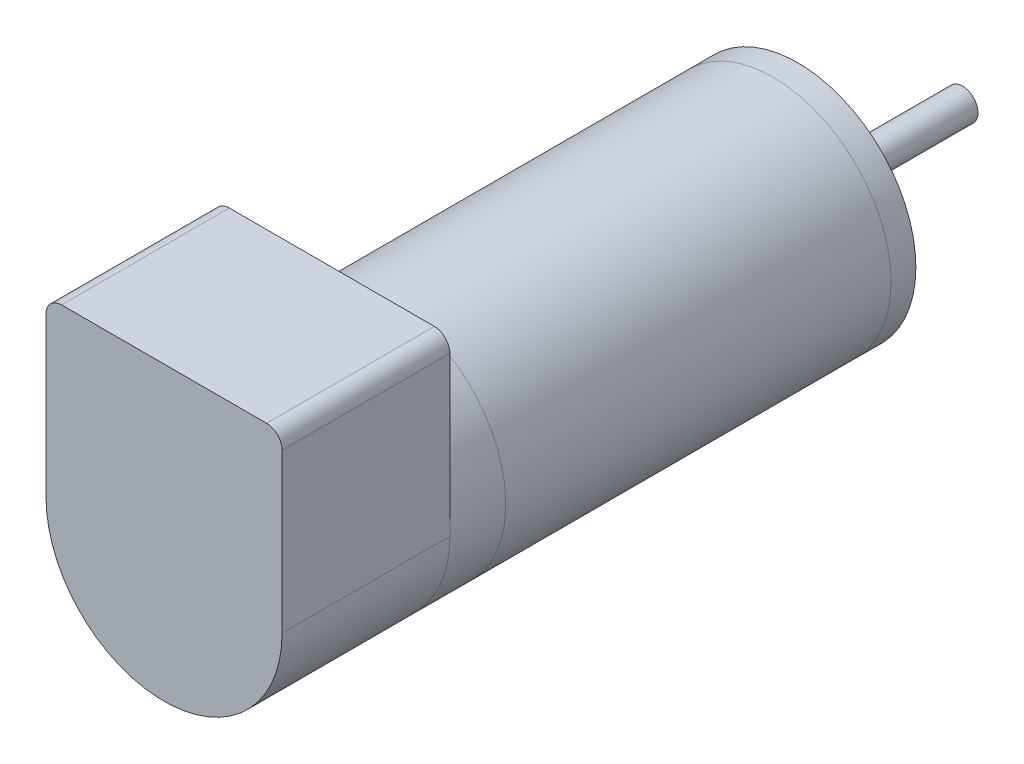
ISO-10303-21;
HEADER;
FILE_DESCRIPTION(('STEP AP214'),'2;1');
FILE_NAME('part.step','',(''),(''),'','','');
FILE_SCHEMA(('AUTOMOTIVE_DESIGN { 1 0 10303 214 1 1 1 1 }'));
ENDSEC;
DATA;
#1=APPLICATION_CONTEXT('core data for automotive mechanical design processes');
#2=APPLICATION_PROTOCOL_DEFINITION('international standard','automotive_design',2000,#1);
#3=PRODUCT_CONTEXT('',#1,'mechanical');
#4=PRODUCT('Part','Part','',(#3));
#5=PRODUCT_RELATED_PRODUCT_CATEGORY('part','',(#4));
#6=PRODUCT_DEFINITION_FORMATION('','',#4);
#7=PRODUCT_DEFINITION_CONTEXT('part definition',#1,'design');
#8=PRODUCT_DEFINITION('design','',#6,#7);
#9=PRODUCT_DEFINITION_SHAPE('','',#8);
#10=(LENGTH_UNIT() NAMED_UNIT(*) SI_UNIT(.MILLI.,.METRE.));
#11=(NAMED_UNIT(*) PLANE_ANGLE_UNIT() SI_UNIT($,.RADIAN.));
#12=(NAMED_UNIT(*) SI_UNIT($,.STERADIAN.) SOLID_ANGLE_UNIT());
#13=UNCERTAINTY_MEASURE_WITH_UNIT(LENGTH_MEASURE(1.E-05),#10,'distance_accuracy_value','');
#14=(GEOMETRIC_REPRESENTATION_CONTEXT(3) GLOBAL_UNCERTAINTY_ASSIGNED_CONTEXT((#13)) GLOBAL_UNIT_ASSIGNED_CONTEXT((#10,
#11,#12)) REPRESENTATION_CONTEXT('',''));
#15=CARTESIAN_POINT('',(0.,0.,0.));
#16=DIRECTION('',(0.,0.,1.));
#17=DIRECTION('',(1.,0.,0.));
#18=AXIS2_PLACEMENT_3D('',#15,#16,#17);
#19=CARTESIAN_POINT('',(0.,0.,0.));
#20=DIRECTION('',(0.,0.,1.));
#21=DIRECTION('',(1.,0.,0.));
#22=AXIS2_PLACEMENT_3D('',#19,#20,#21);
#23=CYLINDRICAL_SURFACE('',#22,19.);
#24=CARTESIAN_POINT('',(0.,0.,0.));
#25=DIRECTION('',(0.,0.,1.));
#26=DIRECTION('',(1.,0.,0.));
#27=AXIS2_PLACEMENT_3D('',#24,#25,#26);
#28=CIRCLE('',#27,19.);
#29=CARTESIAN_POINT('',(19.,0.,0.));
#30=VERTEX_POINT('',#29);
#31=CARTESIAN_POINT('',(0.,19.,0.));
#32=VERTEX_POINT('',#31);
#33=EDGE_CURVE('E150',#30,#32,#28,.T.);
#34=ORIENTED_EDGE('',*,*,#33,.F.);
#35=CARTESIAN_POINT('',(0.,0.,0.));
#36=DIRECTION('',(0.,0.,-1.));
#37=DIRECTION('',(-1.,0.,0.));
#38=AXIS2_PLACEMENT_3D('',#35,#36,#37);
#39=CIRCLE('',#38,19.);
#40=CARTESIAN_POINT('',(0.,-19.,0.));
#41=VERTEX_POINT('',#40);
#42=EDGE_CURVE('E127',#30,#41,#39,.T.);
#43=ORIENTED_EDGE('',*,*,#42,.T.);
#44=CARTESIAN_POINT('',(-19.,0.,0.));
#45=VERTEX_POINT('',#44);
#46=EDGE_CURVE('E157',#41,#45,#39,.T.);
#47=ORIENTED_EDGE('',*,*,#46,.T.);
#48=EDGE_CURVE('E149',#32,#45,#28,.T.);
#49=ORIENTED_EDGE('',*,*,#48,.F.);
#50=EDGE_LOOP('',(#34,#43,#47,#49));
#51=FACE_BOUND('',#50,.T.);
#52=CARTESIAN_POINT('',(0.,0.,-9.));
#53=DIRECTION('',(0.,0.,-1.));
#54=DIRECTION('',(0.,1.,0.));
#55=AXIS2_PLACEMENT_3D('',#52,#53,#54);
#56=CIRCLE('',#55,19.);
#57=CARTESIAN_POINT('',(0.,19.,-9.));
#58=VERTEX_POINT('',#57);
#59=CARTESIAN_POINT('',(0.,-19.,-9.00000000000001));
#60=VERTEX_POINT('',#59);
#61=EDGE_CURVE('E11',#58,#60,#56,.T.);
#62=ORIENTED_EDGE('',*,*,#61,.F.);
#63=EDGE_CURVE('E41',#60,#58,#56,.T.);
#64=ORIENTED_EDGE('',*,*,#63,.F.);
#65=EDGE_LOOP('',(#62,#64));
#66=FACE_BOUND('',#65,.T.);
#67=ADVANCED_FACE('F37',(#51,#66),#23,.T.);
#68=ORIENTED_EDGE('',*,*,#42,.F.);
#69=DIRECTION('',(0.,0.,-1.));
#70=VECTOR('',#69,1.);
#71=CARTESIAN_POINT('',(19.,0.,27.));
#72=LINE('',#71,#70);
#73=CARTESIAN_POINT('',(19.,0.,27.));
#74=VERTEX_POINT('',#73);
#75=EDGE_CURVE('E108',#74,#30,#72,.T.);
#76=ORIENTED_EDGE('',*,*,#75,.F.);
#77=CARTESIAN_POINT('',(0.,0.,27.));
#78=DIRECTION('',(0.,0.,1.));
#79=DIRECTION('',(1.,0.,0.));
#80=AXIS2_PLACEMENT_3D('',#77,#78,#79);
#81=CIRCLE('',#80,19.);
#82=CARTESIAN_POINT('',(-19.,0.,27.));
#83=VERTEX_POINT('',#82);
#84=EDGE_CURVE('E114',#83,#74,#81,.T.);
#85=ORIENTED_EDGE('',*,*,#84,.F.);
#86=DIRECTION('',(0.,0.,-1.));
#87=VECTOR('',#86,1.);
#88=CARTESIAN_POINT('',(-19.,0.,27.));
#89=LINE('',#88,#87);
#90=EDGE_CURVE('E204',#83,#45,#89,.T.);
#91=ORIENTED_EDGE('',*,*,#90,.T.);
#92=ORIENTED_EDGE('',*,*,#46,.F.);
#93=EDGE_LOOP('',(#68,#76,#85,#91,#92));
#94=FACE_BOUND('',#93,.T.);
#95=ADVANCED_FACE('F125',(#94),#23,.T.);
#96=ORIENTED_EDGE('',*,*,#63,.T.);
#97=ORIENTED_EDGE('',*,*,#61,.T.);
#98=EDGE_LOOP('',(#96,#97));
#99=FACE_BOUND('',#98,.T.);
#100=CARTESIAN_POINT('',(0.,0.,-71.));
#101=DIRECTION('',(0.,0.,-1.));
#102=DIRECTION('',(-1.,0.,0.));
#103=AXIS2_PLACEMENT_3D('',#100,#101,#102);
#104=CIRCLE('',#103,19.);
#105=CARTESIAN_POINT('',(0.,19.,-71.));
#106=VERTEX_POINT('',#105);
#107=CARTESIAN_POINT('',(0.,-19.,-71.));
#108=VERTEX_POINT('',#107);
#109=EDGE_CURVE('E156',#106,#108,#104,.T.);
#110=ORIENTED_EDGE('',*,*,#109,.F.);
#111=EDGE_CURVE('E153',#108,#106,#104,.T.);
#112=ORIENTED_EDGE('',*,*,#111,.F.);
#113=EDGE_LOOP('',(#110,#112));
#114=FACE_BOUND('',#113,.T.);
#115=ADVANCED_FACE('F172',(#99,#114),#23,.T.);
#116=ORIENTED_EDGE('',*,*,#111,.T.);
#117=ORIENTED_EDGE('',*,*,#109,.T.);
#118=EDGE_LOOP('',(#116,#117));
#119=FACE_BOUND('',#118,.T.);
#120=CARTESIAN_POINT('',(0.,0.,-75.));
#121=DIRECTION('',(0.,0.,1.));
#122=DIRECTION('',(1.,0.,0.));
#123=AXIS2_PLACEMENT_3D('',#120,#121,#122);
#124=CIRCLE('',#123,19.);
#125=CARTESIAN_POINT('',(19.,0.,-75.));
#126=VERTEX_POINT('',#125);
#127=EDGE_CURVE('E146',#126,#126,#124,.T.);
#128=ORIENTED_EDGE('',*,*,#127,.T.);
#129=EDGE_LOOP('',(#128));
#130=FACE_BOUND('',#129,.T.);
#131=ADVANCED_FACE('F39',(#119,#130),#23,.T.);
#132=CARTESIAN_POINT('',(0.,19.,-75.));
#133=DIRECTION('',(0.,0.,1.));
#134=DIRECTION('',(1.,0.,0.));
#135=AXIS2_PLACEMENT_3D('',#132,#133,#134);
#136=PLANE('',#135);
#137=CARTESIAN_POINT('',(8.83883476483179,-8.83883476483189,-75.));
#138=DIRECTION('',(0.,0.,-1.));
#139=DIRECTION('',(-1.,0.,0.));
#140=AXIS2_PLACEMENT_3D('',#137,#138,#139);
#141=CIRCLE('',#140,1.50000000000011);
#142=CARTESIAN_POINT('',(7.33883476483168,-8.83883476483189,-75.));
#143=VERTEX_POINT('',#142);
#144=EDGE_CURVE('E234',#143,#143,#141,.T.);
#145=ORIENTED_EDGE('',*,*,#144,.F.);
#146=EDGE_LOOP('',(#145));
#147=FACE_BOUND('',#146,.T.);
#148=CARTESIAN_POINT('',(-8.83883476483189,-8.83883476483179,-75.));
#149=DIRECTION('',(0.,0.,-1.));
#150=DIRECTION('',(-1.,0.,0.));
#151=AXIS2_PLACEMENT_3D('',#148,#149,#150);
#152=CIRCLE('',#151,1.50000000000007);
#153=CARTESIAN_POINT('',(-10.338834764832,-8.83883476483179,-75.));
#154=VERTEX_POINT('',#153);
#155=EDGE_CURVE('E240',#154,#154,#152,.T.);
#156=ORIENTED_EDGE('',*,*,#155,.F.);
#157=EDGE_LOOP('',(#156));
#158=FACE_BOUND('',#157,.T.);
#159=CARTESIAN_POINT('',(-8.83883476483179,8.83883476483189,-75.));
#160=DIRECTION('',(0.,0.,-1.));
#161=DIRECTION('',(-1.,0.,0.));
#162=AXIS2_PLACEMENT_3D('',#159,#160,#161);
#163=CIRCLE('',#162,1.50000000000003);
#164=CARTESIAN_POINT('',(-10.3388347648318,8.83883476483189,-75.));
#165=VERTEX_POINT('',#164);
#166=EDGE_CURVE('E246',#165,#165,#163,.T.);
#167=ORIENTED_EDGE('',*,*,#166,.F.);
#168=EDGE_LOOP('',(#167));
#169=FACE_BOUND('',#168,.T.);
#170=CARTESIAN_POINT('',(8.83883476483189,8.83883476483179,-75.));
#171=DIRECTION('',(0.,0.,-1.));
#172=DIRECTION('',(-1.,0.,0.));
#173=AXIS2_PLACEMENT_3D('',#170,#171,#172);
#174=CIRCLE('',#173,1.5);
#175=CARTESIAN_POINT('',(7.3388347648319,8.83883476483179,-75.));
#176=VERTEX_POINT('',#175);
#177=EDGE_CURVE('E194',#176,#176,#174,.T.);
#178=ORIENTED_EDGE('',*,*,#177,.F.);
#179=EDGE_LOOP('',(#178));
#180=FACE_BOUND('',#179,.T.);
#181=ORIENTED_EDGE('',*,*,#127,.F.);
#182=EDGE_LOOP('',(#181));
#183=FACE_BOUND('',#182,.T.);
#184=CARTESIAN_POINT('',(0.,0.,-75.));
#185=DIRECTION('',(0.,0.,1.));
#186=DIRECTION('',(1.,0.,0.));
#187=AXIS2_PLACEMENT_3D('',#184,#185,#186);
#188=CIRCLE('',#187,6.25);
#189=CARTESIAN_POINT('',(6.25,0.,-75.));
#190=VERTEX_POINT('',#189);
#191=EDGE_CURVE('E143',#190,#190,#188,.T.);
#192=ORIENTED_EDGE('',*,*,#191,.T.);
#193=EDGE_LOOP('',(#192));
#194=FACE_BOUND('',#193,.T.);
#195=ADVANCED_FACE('F178',(#147,#158,#169,#180,#183,#194),#136,.F.);
#196=CARTESIAN_POINT('',(0.,0.,0.));
#197=DIRECTION('',(0.,0.,1.));
#198=DIRECTION('',(1.,0.,0.));
#199=AXIS2_PLACEMENT_3D('',#196,#197,#198);
#200=CYLINDRICAL_SURFACE('',#199,6.25);
#201=ORIENTED_EDGE('',*,*,#191,.F.);
#202=EDGE_LOOP('',(#201));
#203=FACE_BOUND('',#202,.T.);
#204=CARTESIAN_POINT('',(0.,0.,-76.5));
#205=DIRECTION('',(0.,0.,1.));
#206=DIRECTION('',(1.,0.,0.));
#207=AXIS2_PLACEMENT_3D('',#204,#205,#206);
#208=CIRCLE('',#207,6.25);
#209=CARTESIAN_POINT('',(6.25,0.,-76.5));
#210=VERTEX_POINT('',#209);
#211=EDGE_CURVE('E140',#210,#210,#208,.T.);
#212=ORIENTED_EDGE('',*,*,#211,.T.);
#213=EDGE_LOOP('',(#212));
#214=FACE_BOUND('',#213,.T.);
#215=ADVANCED_FACE('F263',(#203,#214),#200,.T.);
#216=CARTESIAN_POINT('',(0.,6.25,-76.5));
#217=DIRECTION('',(0.,0.,1.));
#218=DIRECTION('',(1.,0.,0.));
#219=AXIS2_PLACEMENT_3D('',#216,#217,#218);
#220=PLANE('',#219);
#221=ORIENTED_EDGE('',*,*,#211,.F.);
#222=EDGE_LOOP('',(#221));
#223=FACE_BOUND('',#222,.T.);
#224=CARTESIAN_POINT('',(0.,0.,-76.5));
#225=DIRECTION('',(0.,0.,1.));
#226=DIRECTION('',(1.,0.,0.));
#227=AXIS2_PLACEMENT_3D('',#224,#225,#226);
#228=CIRCLE('',#227,2.5);
#229=CARTESIAN_POINT('',(2.5,0.,-76.5));
#230=VERTEX_POINT('',#229);
#231=EDGE_CURVE('E132',#230,#230,#228,.T.);
#232=ORIENTED_EDGE('',*,*,#231,.T.);
#233=EDGE_LOOP('',(#232));
#234=FACE_BOUND('',#233,.T.);
#235=ADVANCED_FACE('F273',(#223,#234),#220,.F.);
#236=CARTESIAN_POINT('',(0.,0.,0.));
#237=DIRECTION('',(0.,0.,1.));
#238=DIRECTION('',(1.,0.,0.));
#239=AXIS2_PLACEMENT_3D('',#236,#237,#238);
#240=CYLINDRICAL_SURFACE('',#239,2.5);
#241=ORIENTED_EDGE('',*,*,#231,.F.);
#242=EDGE_LOOP('',(#241));
#243=FACE_BOUND('',#242,.T.);
#244=CARTESIAN_POINT('',(0.,0.,-101.5));
#245=DIRECTION('',(0.,0.,1.));
#246=DIRECTION('',(1.,0.,0.));
#247=AXIS2_PLACEMENT_3D('',#244,#245,#246);
#248=CIRCLE('',#247,2.5);
#249=CARTESIAN_POINT('',(2.5,0.,-101.5));
#250=VERTEX_POINT('',#249);
#251=EDGE_CURVE('E129',#250,#250,#248,.T.);
#252=ORIENTED_EDGE('',*,*,#251,.T.);
#253=EDGE_LOOP('',(#252));
#254=FACE_BOUND('',#253,.T.);
#255=ADVANCED_FACE('F279',(#243,#254),#240,.T.);
#256=CARTESIAN_POINT('',(0.,2.5,-101.5));
#257=DIRECTION('',(0.,0.,1.));
#258=DIRECTION('',(1.,0.,0.));
#259=AXIS2_PLACEMENT_3D('',#256,#257,#258);
#260=PLANE('',#259);
#261=ORIENTED_EDGE('',*,*,#251,.F.);
#262=EDGE_LOOP('',(#261));
#263=FACE_BOUND('',#262,.T.);
#264=ADVANCED_FACE('F285',(#263),#260,.F.);
#265=CARTESIAN_POINT('',(0.,0.,0.));
#266=DIRECTION('',(0.,0.,1.));
#267=DIRECTION('',(1.,0.,0.));
#268=AXIS2_PLACEMENT_3D('',#265,#266,#267);
#269=PLANE('',#268);
#270=DIRECTION('',(0.,1.,0.));
#271=VECTOR('',#270,1.);
#272=CARTESIAN_POINT('',(19.,25.5,0.));
#273=LINE('',#272,#271);
#274=CARTESIAN_POINT('',(19.,25.5,0.));
#275=VERTEX_POINT('',#274);
#276=EDGE_CURVE('E185',#30,#275,#273,.T.);
#277=ORIENTED_EDGE('',*,*,#276,.F.);
#278=ORIENTED_EDGE('',*,*,#33,.T.);
#279=ORIENTED_EDGE('',*,*,#48,.T.);
#280=DIRECTION('',(0.,-1.,0.));
#281=VECTOR('',#280,1.);
#282=CARTESIAN_POINT('',(-19.,0.,0.));
#283=LINE('',#282,#281);
#284=CARTESIAN_POINT('',(-19.,25.5,0.));
#285=VERTEX_POINT('',#284);
#286=EDGE_CURVE('E123',#285,#45,#283,.T.);
#287=ORIENTED_EDGE('',*,*,#286,.F.);
#288=CARTESIAN_POINT('',(-16.5,25.5,0.));
#289=DIRECTION('',(0.,0.,1.));
#290=DIRECTION('',(-1.,0.,0.));
#291=AXIS2_PLACEMENT_3D('',#288,#289,#290);
#292=CIRCLE('',#291,2.5);
#293=CARTESIAN_POINT('',(-16.5,28.,0.));
#294=VERTEX_POINT('',#293);
#295=EDGE_CURVE('E200',#294,#285,#292,.T.);
#296=ORIENTED_EDGE('',*,*,#295,.F.);
#297=DIRECTION('',(-1.,0.,0.));
#298=VECTOR('',#297,1.);
#299=CARTESIAN_POINT('',(-16.5,28.,0.));
#300=LINE('',#299,#298);
#301=CARTESIAN_POINT('',(16.5,28.,0.));
#302=VERTEX_POINT('',#301);
#303=EDGE_CURVE('E191',#302,#294,#300,.T.);
#304=ORIENTED_EDGE('',*,*,#303,.F.);
#305=CARTESIAN_POINT('',(16.5,25.5,0.));
#306=DIRECTION('',(0.,0.,1.));
#307=DIRECTION('',(1.,0.,0.));
#308=AXIS2_PLACEMENT_3D('',#305,#306,#307);
#309=CIRCLE('',#308,2.5);
#310=EDGE_CURVE('E188',#275,#302,#309,.T.);
#311=ORIENTED_EDGE('',*,*,#310,.F.);
#312=EDGE_LOOP('',(#277,#278,#279,#287,#296,#304,#311));
#313=FACE_BOUND('',#312,.T.);
#314=ADVANCED_FACE('F186',(#313),#269,.F.);
#315=CARTESIAN_POINT('',(19.,25.5,27.));
#316=DIRECTION('',(-1.,0.,0.));
#317=DIRECTION('',(0.,0.,1.));
#318=AXIS2_PLACEMENT_3D('',#315,#316,#317);
#319=PLANE('',#318);
#320=ORIENTED_EDGE('',*,*,#276,.T.);
#321=DIRECTION('',(0.,0.,-1.));
#322=VECTOR('',#321,1.);
#323=CARTESIAN_POINT('',(19.,25.5,27.));
#324=LINE('',#323,#322);
#325=CARTESIAN_POINT('',(19.,25.5,27.));
#326=VERTEX_POINT('',#325);
#327=EDGE_CURVE('E110',#326,#275,#324,.T.);
#328=ORIENTED_EDGE('',*,*,#327,.F.);
#329=DIRECTION('',(0.,1.,0.));
#330=VECTOR('',#329,1.);
#331=CARTESIAN_POINT('',(19.,25.5,27.));
#332=LINE('',#331,#330);
#333=EDGE_CURVE('E104',#74,#326,#332,.T.);
#334=ORIENTED_EDGE('',*,*,#333,.F.);
#335=ORIENTED_EDGE('',*,*,#75,.T.);
#336=EDGE_LOOP('',(#320,#328,#334,#335));
#337=FACE_BOUND('',#336,.T.);
#338=ADVANCED_FACE('F106',(#337),#319,.F.);
#339=CARTESIAN_POINT('',(16.5,25.5,27.));
#340=DIRECTION('',(0.,0.,-1.));
#341=DIRECTION('',(-1.,0.,0.));
#342=AXIS2_PLACEMENT_3D('',#339,#340,#341);
#343=CYLINDRICAL_SURFACE('',#342,2.5);
#344=ORIENTED_EDGE('',*,*,#310,.T.);
#345=DIRECTION('',(0.,0.,-1.));
#346=VECTOR('',#345,1.);
#347=CARTESIAN_POINT('',(16.5,28.,27.));
#348=LINE('',#347,#346);
#349=CARTESIAN_POINT('',(16.5,28.,27.));
#350=VERTEX_POINT('',#349);
#351=EDGE_CURVE('E134',#350,#302,#348,.T.);
#352=ORIENTED_EDGE('',*,*,#351,.F.);
#353=CARTESIAN_POINT('',(16.5,25.5,27.));
#354=DIRECTION('',(0.,0.,1.));
#355=DIRECTION('',(1.,0.,0.));
#356=AXIS2_PLACEMENT_3D('',#353,#354,#355);
#357=CIRCLE('',#356,2.5);
#358=EDGE_CURVE('E113',#326,#350,#357,.T.);
#359=ORIENTED_EDGE('',*,*,#358,.F.);
#360=ORIENTED_EDGE('',*,*,#327,.T.);
#361=EDGE_LOOP('',(#344,#352,#359,#360));
#362=FACE_BOUND('',#361,.T.);
#363=ADVANCED_FACE('F298',(#362),#343,.T.);
#364=CARTESIAN_POINT('',(-16.5,28.,27.));
#365=DIRECTION('',(0.,-1.,0.));
#366=DIRECTION('',(0.,0.,-1.));
#367=AXIS2_PLACEMENT_3D('',#364,#365,#366);
#368=PLANE('',#367);
#369=ORIENTED_EDGE('',*,*,#303,.T.);
#370=DIRECTION('',(0.,0.,-1.));
#371=VECTOR('',#370,1.);
#372=CARTESIAN_POINT('',(-16.5,28.,27.));
#373=LINE('',#372,#371);
#374=CARTESIAN_POINT('',(-16.5,28.,27.));
#375=VERTEX_POINT('',#374);
#376=EDGE_CURVE('E209',#375,#294,#373,.T.);
#377=ORIENTED_EDGE('',*,*,#376,.F.);
#378=DIRECTION('',(-1.,0.,0.));
#379=VECTOR('',#378,1.);
#380=CARTESIAN_POINT('',(-16.5,28.,27.));
#381=LINE('',#380,#379);
#382=EDGE_CURVE('E217',#350,#375,#381,.T.);
#383=ORIENTED_EDGE('',*,*,#382,.F.);
#384=ORIENTED_EDGE('',*,*,#351,.T.);
#385=EDGE_LOOP('',(#369,#377,#383,#384));
#386=FACE_BOUND('',#385,.T.);
#387=ADVANCED_FACE('F215',(#386),#368,.F.);
#388=CARTESIAN_POINT('',(-16.5,25.5,27.));
#389=DIRECTION('',(0.,0.,-1.));
#390=DIRECTION('',(-1.,0.,0.));
#391=AXIS2_PLACEMENT_3D('',#388,#389,#390);
#392=CYLINDRICAL_SURFACE('',#391,2.5);
#393=ORIENTED_EDGE('',*,*,#295,.T.);
#394=DIRECTION('',(0.,0.,-1.));
#395=VECTOR('',#394,1.);
#396=CARTESIAN_POINT('',(-19.,25.5,27.));
#397=LINE('',#396,#395);
#398=CARTESIAN_POINT('',(-19.,25.5,27.));
#399=VERTEX_POINT('',#398);
#400=EDGE_CURVE('E206',#399,#285,#397,.T.);
#401=ORIENTED_EDGE('',*,*,#400,.F.);
#402=CARTESIAN_POINT('',(-16.5,25.5,27.));
#403=DIRECTION('',(0.,0.,1.));
#404=DIRECTION('',(-1.,0.,0.));
#405=AXIS2_PLACEMENT_3D('',#402,#403,#404);
#406=CIRCLE('',#405,2.5);
#407=EDGE_CURVE('E227',#375,#399,#406,.T.);
#408=ORIENTED_EDGE('',*,*,#407,.F.);
#409=ORIENTED_EDGE('',*,*,#376,.T.);
#410=EDGE_LOOP('',(#393,#401,#408,#409));
#411=FACE_BOUND('',#410,.T.);
#412=ADVANCED_FACE('F223',(#411),#392,.T.);
#413=CARTESIAN_POINT('',(-19.,0.,27.));
#414=DIRECTION('',(1.,0.,0.));
#415=DIRECTION('',(0.,0.,-1.));
#416=AXIS2_PLACEMENT_3D('',#413,#414,#415);
#417=PLANE('',#416);
#418=ORIENTED_EDGE('',*,*,#286,.T.);
#419=ORIENTED_EDGE('',*,*,#90,.F.);
#420=DIRECTION('',(0.,-1.,0.));
#421=VECTOR('',#420,1.);
#422=CARTESIAN_POINT('',(-19.,0.,27.));
#423=LINE('',#422,#421);
#424=EDGE_CURVE('E119',#399,#83,#423,.T.);
#425=ORIENTED_EDGE('',*,*,#424,.F.);
#426=ORIENTED_EDGE('',*,*,#400,.T.);
#427=EDGE_LOOP('',(#418,#419,#425,#426));
#428=FACE_BOUND('',#427,.T.);
#429=ADVANCED_FACE('F226',(#428),#417,.F.);
#430=CARTESIAN_POINT('',(0.,0.,27.));
#431=DIRECTION('',(0.,0.,1.));
#432=DIRECTION('',(1.,0.,0.));
#433=AXIS2_PLACEMENT_3D('',#430,#431,#432);
#434=PLANE('',#433);
#435=ORIENTED_EDGE('',*,*,#84,.T.);
#436=ORIENTED_EDGE('',*,*,#333,.T.);
#437=ORIENTED_EDGE('',*,*,#358,.T.);
#438=ORIENTED_EDGE('',*,*,#382,.T.);
#439=ORIENTED_EDGE('',*,*,#407,.T.);
#440=ORIENTED_EDGE('',*,*,#424,.T.);
#441=EDGE_LOOP('',(#435,#436,#437,#438,#439,#440));
#442=FACE_BOUND('',#441,.T.);
#443=ADVANCED_FACE('F117',(#442),#434,.T.);
#444=CARTESIAN_POINT('',(8.83883476483189,8.83883476483179,-65.));
#445=DIRECTION('',(0.,0.,-1.));
#446=DIRECTION('',(-1.,0.,0.));
#447=AXIS2_PLACEMENT_3D('',#444,#445,#446);
#448=CYLINDRICAL_SURFACE('',#447,1.5);
#449=CARTESIAN_POINT('',(8.83883476483189,8.83883476483179,-65.));
#450=DIRECTION('',(0.,0.,-1.));
#451=DIRECTION('',(-1.,0.,0.));
#452=AXIS2_PLACEMENT_3D('',#449,#450,#451);
#453=CIRCLE('',#452,1.5);
#454=CARTESIAN_POINT('',(7.3388347648319,8.83883476483179,-65.));
#455=VERTEX_POINT('',#454);
#456=EDGE_CURVE('E189',#455,#455,#453,.T.);
#457=ORIENTED_EDGE('',*,*,#456,.F.);
#458=EDGE_LOOP('',(#457));
#459=FACE_BOUND('',#458,.T.);
#460=ORIENTED_EDGE('',*,*,#177,.T.);
#461=EDGE_LOOP('',(#460));
#462=FACE_BOUND('',#461,.T.);
#463=ADVANCED_FACE('F309',(#459,#462),#448,.F.);
#464=CARTESIAN_POINT('',(8.83883476483189,8.83883476483179,-65.));
#465=DIRECTION('',(0.,0.,-1.));
#466=DIRECTION('',(-1.,0.,0.));
#467=AXIS2_PLACEMENT_3D('',#464,#465,#466);
#468=PLANE('',#467);
#469=ORIENTED_EDGE('',*,*,#456,.T.);
#470=EDGE_LOOP('',(#469));
#471=FACE_BOUND('',#470,.T.);
#472=ADVANCED_FACE('F257',(#471),#468,.T.);
#473=CARTESIAN_POINT('',(-8.83883476483179,8.83883476483189,-65.));
#474=DIRECTION('',(0.,0.,-1.));
#475=DIRECTION('',(-1.,0.,0.));
#476=AXIS2_PLACEMENT_3D('',#473,#474,#475);
#477=CYLINDRICAL_SURFACE('',#476,1.50000000000003);
#478=CARTESIAN_POINT('',(-8.83883476483179,8.83883476483189,-65.));
#479=DIRECTION('',(0.,0.,-1.));
#480=DIRECTION('',(-1.,0.,0.));
#481=AXIS2_PLACEMENT_3D('',#478,#479,#480);
#482=CIRCLE('',#481,1.50000000000003);
#483=CARTESIAN_POINT('',(-10.3388347648318,8.83883476483189,-65.));
#484=VERTEX_POINT('',#483);
#485=EDGE_CURVE('E232',#484,#484,#482,.T.);
#486=ORIENTED_EDGE('',*,*,#485,.F.);
#487=EDGE_LOOP('',(#486));
#488=FACE_BOUND('',#487,.T.);
#489=ORIENTED_EDGE('',*,*,#166,.T.);
#490=EDGE_LOOP('',(#489));
#491=FACE_BOUND('',#490,.T.);
#492=ADVANCED_FACE('F254',(#488,#491),#477,.F.);
#493=CARTESIAN_POINT('',(-8.83883476483179,8.83883476483189,-65.));
#494=DIRECTION('',(0.,0.,-1.));
#495=DIRECTION('',(-1.,0.,0.));
#496=AXIS2_PLACEMENT_3D('',#493,#494,#495);
#497=PLANE('',#496);
#498=ORIENTED_EDGE('',*,*,#485,.T.);
#499=EDGE_LOOP('',(#498));
#500=FACE_BOUND('',#499,.T.);
#501=ADVANCED_FACE('F252',(#500),#497,.T.);
#502=CARTESIAN_POINT('',(-8.83883476483189,-8.83883476483179,-65.));
#503=DIRECTION('',(0.,0.,-1.));
#504=DIRECTION('',(-1.,0.,0.));
#505=AXIS2_PLACEMENT_3D('',#502,#503,#504);
#506=CYLINDRICAL_SURFACE('',#505,1.50000000000007);
#507=CARTESIAN_POINT('',(-8.83883476483189,-8.83883476483179,-65.));
#508=DIRECTION('',(0.,0.,-1.));
#509=DIRECTION('',(-1.,0.,0.));
#510=AXIS2_PLACEMENT_3D('',#507,#508,#509);
#511=CIRCLE('',#510,1.50000000000007);
#512=CARTESIAN_POINT('',(-10.338834764832,-8.83883476483179,-65.));
#513=VERTEX_POINT('',#512);
#514=EDGE_CURVE('E243',#513,#513,#511,.T.);
#515=ORIENTED_EDGE('',*,*,#514,.F.);
#516=EDGE_LOOP('',(#515));
#517=FACE_BOUND('',#516,.T.);
#518=ORIENTED_EDGE('',*,*,#155,.T.);
#519=EDGE_LOOP('',(#518));
#520=FACE_BOUND('',#519,.T.);
#521=ADVANCED_FACE('F325',(#517,#520),#506,.F.);
#522=CARTESIAN_POINT('',(-8.83883476483189,-8.83883476483179,-65.));
#523=DIRECTION('',(0.,0.,-1.));
#524=DIRECTION('',(-1.,0.,0.));
#525=AXIS2_PLACEMENT_3D('',#522,#523,#524);
#526=PLANE('',#525);
#527=ORIENTED_EDGE('',*,*,#514,.T.);
#528=EDGE_LOOP('',(#527));
#529=FACE_BOUND('',#528,.T.);
#530=ADVANCED_FACE('F320',(#529),#526,.T.);
#531=CARTESIAN_POINT('',(8.83883476483179,-8.83883476483189,-65.));
#532=DIRECTION('',(0.,0.,-1.));
#533=DIRECTION('',(-1.,0.,0.));
#534=AXIS2_PLACEMENT_3D('',#531,#532,#533);
#535=CYLINDRICAL_SURFACE('',#534,1.50000000000011);
#536=CARTESIAN_POINT('',(8.83883476483179,-8.83883476483189,-65.));
#537=DIRECTION('',(0.,0.,-1.));
#538=DIRECTION('',(-1.,0.,0.));
#539=AXIS2_PLACEMENT_3D('',#536,#537,#538);
#540=CIRCLE('',#539,1.50000000000011);
#541=CARTESIAN_POINT('',(7.33883476483168,-8.83883476483189,-65.));
#542=VERTEX_POINT('',#541);
#543=EDGE_CURVE('E237',#542,#542,#540,.T.);
#544=ORIENTED_EDGE('',*,*,#543,.F.);
#545=EDGE_LOOP('',(#544));
#546=FACE_BOUND('',#545,.T.);
#547=ORIENTED_EDGE('',*,*,#144,.T.);
#548=EDGE_LOOP('',(#547));
#549=FACE_BOUND('',#548,.T.);
#550=ADVANCED_FACE('F316',(#546,#549),#535,.F.);
#551=CARTESIAN_POINT('',(8.83883476483179,-8.83883476483189,-65.));
#552=DIRECTION('',(0.,0.,-1.));
#553=DIRECTION('',(-1.,0.,0.));
#554=AXIS2_PLACEMENT_3D('',#551,#552,#553);
#555=PLANE('',#554);
#556=ORIENTED_EDGE('',*,*,#543,.T.);
#557=EDGE_LOOP('',(#556));
#558=FACE_BOUND('',#557,.T.);
#559=ADVANCED_FACE('F319',(#558),#555,.T.);
#560=CLOSED_SHELL('',(#67,#95,#115,#131,#195,#215,#235,#255,#264,#314,#338,#363,#387,#412,#429,
#443,#463,#472,#492,#501,#521,#530,#550,#559));
#561=MANIFOLD_SOLID_BREP('B2',#560);
#562=ADVANCED_BREP_SHAPE_REPRESENTATION('',(#18,#561),#14);
#563=SHAPE_DEFINITION_REPRESENTATION(#9,#562);
ENDSEC;
END-ISO-10303-21;
